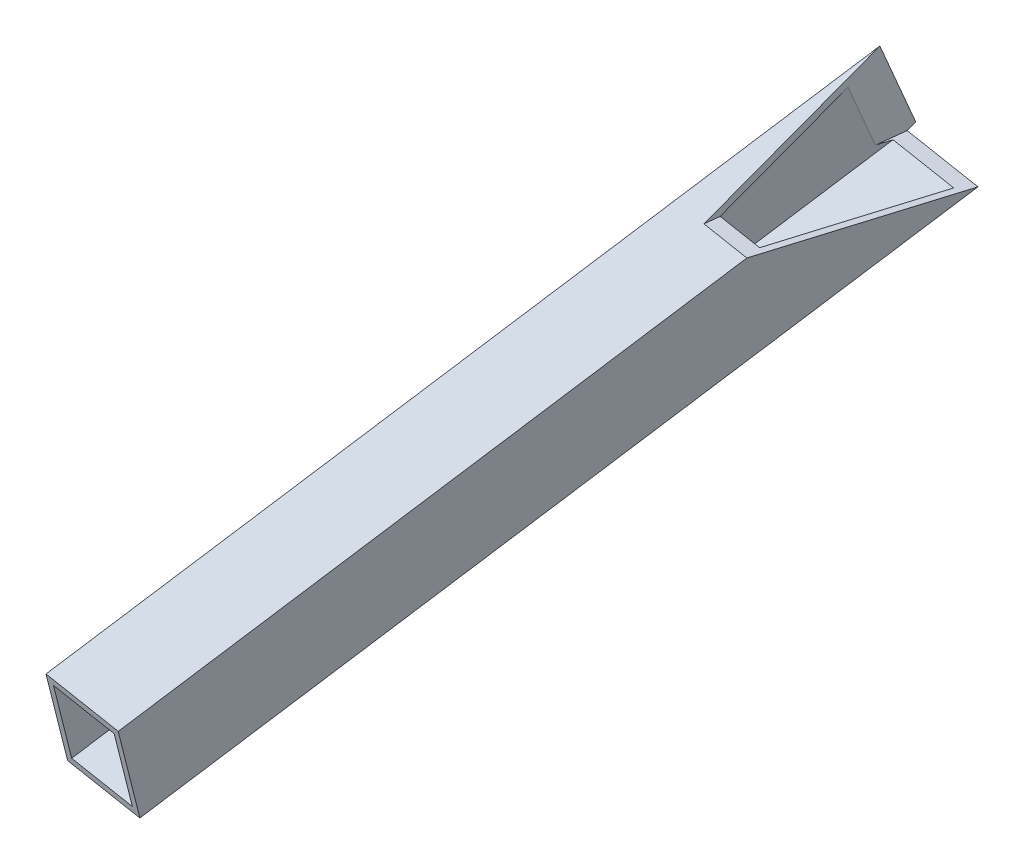
ISO-10303-21;
HEADER;
FILE_DESCRIPTION(('STEP AP214'),'2;1');
FILE_NAME('part.step','',(''),(''),'','','');
FILE_SCHEMA(('AUTOMOTIVE_DESIGN { 1 0 10303 214 1 1 1 1 }'));
ENDSEC;
DATA;
#1=APPLICATION_CONTEXT('core data for automotive mechanical design processes');
#2=APPLICATION_PROTOCOL_DEFINITION('international standard','automotive_design',2000,#1);
#3=PRODUCT_CONTEXT('',#1,'mechanical');
#4=PRODUCT('Part','Part','',(#3));
#5=PRODUCT_RELATED_PRODUCT_CATEGORY('part','',(#4));
#6=PRODUCT_DEFINITION_FORMATION('','',#4);
#7=PRODUCT_DEFINITION_CONTEXT('part definition',#1,'design');
#8=PRODUCT_DEFINITION('design','',#6,#7);
#9=PRODUCT_DEFINITION_SHAPE('','',#8);
#10=(LENGTH_UNIT() NAMED_UNIT(*) SI_UNIT(.MILLI.,.METRE.));
#11=(NAMED_UNIT(*) PLANE_ANGLE_UNIT() SI_UNIT($,.RADIAN.));
#12=(NAMED_UNIT(*) SI_UNIT($,.STERADIAN.) SOLID_ANGLE_UNIT());
#13=UNCERTAINTY_MEASURE_WITH_UNIT(LENGTH_MEASURE(1.E-05),#10,'distance_accuracy_value','');
#14=(GEOMETRIC_REPRESENTATION_CONTEXT(3) GLOBAL_UNCERTAINTY_ASSIGNED_CONTEXT((#13)) GLOBAL_UNIT_ASSIGNED_CONTEXT((#10,
#11,#12)) REPRESENTATION_CONTEXT('',''));
#15=CARTESIAN_POINT('',(0.,0.,0.));
#16=DIRECTION('',(0.,0.,1.));
#17=DIRECTION('',(1.,0.,0.));
#18=AXIS2_PLACEMENT_3D('',#15,#16,#17);
#19=CARTESIAN_POINT('',(120.271431735148,-89.5681767849917,-771.716881801796));
#20=DIRECTION('',(-0.0730777748475653,0.8837399036516,0.462237408175917));
#21=DIRECTION('',(0.,-0.463476631168993,0.886109142465104));
#22=AXIS2_PLACEMENT_3D('',#19,#20,#21);
#23=PLANE('',#22);
#24=DIRECTION('',(0.100365969727087,0.467640360068513,-0.878202235112012));
#25=VECTOR('',#24,1.);
#26=CARTESIAN_POINT('',(133.655988921439,-89.3282877179119,-770.059477831639));
#27=LINE('',#26,#25);
#28=CARTESIAN_POINT('',(150.681594928652,-10.,-919.03353039475));
#29=VERTEX_POINT('',#28);
#30=CARTESIAN_POINT('',(150.886848921255,-9.0436494434575,-920.829502830028));
#31=VERTEX_POINT('',#30);
#32=EDGE_CURVE('E123',#29,#31,#27,.T.);
#33=ORIENTED_EDGE('',*,*,#32,.F.);
#34=DIRECTION('',(-0.987732357643365,0.,-0.156156298829986));
#35=VECTOR('',#34,1.);
#36=CARTESIAN_POINT('',(143.73518973951,-10.,-920.131727609933));
#37=LINE('',#36,#35);
#38=CARTESIAN_POINT('',(170.285714285714,-10.,-915.934202224593));
#39=VERTEX_POINT('',#38);
#40=EDGE_CURVE('E113',#39,#29,#37,.T.);
#41=ORIENTED_EDGE('',*,*,#40,.F.);
#42=DIRECTION('',(0.290549227996289,0.462237408175917,-0.837805302318845));
#43=VECTOR('',#42,1.);
#44=CARTESIAN_POINT('',(120.271431735148,-89.5681767849917,-771.716881801796));
#45=LINE('',#44,#43);
#46=CARTESIAN_POINT('',(120.,-89.9999999999999,-770.934202224594));
#47=VERTEX_POINT('',#46);
#48=EDGE_CURVE('E168',#47,#39,#45,.T.);
#49=ORIENTED_EDGE('',*,*,#48,.F.);
#50=DIRECTION('',(0.987732357643365,0.,0.156156298829986));
#51=VECTOR('',#50,1.);
#52=CARTESIAN_POINT('',(120.144091938925,-89.9999999999999,-770.911421899843));
#53=LINE('',#52,#51);
#54=CARTESIAN_POINT('',(100.,-89.9999999999999,-774.096117446295));
#55=VERTEX_POINT('',#54);
#56=EDGE_CURVE('E161',#55,#47,#53,.T.);
#57=ORIENTED_EDGE('',*,*,#56,.F.);
#58=DIRECTION('',(0.290549227996289,0.462237408175917,-0.837805302318845));
#59=VECTOR('',#58,1.);
#60=CARTESIAN_POINT('',(101.190123761803,-88.1066212880405,-777.527866361722));
#61=LINE('',#60,#59);
#62=EDGE_CURVE('E131',#55,#31,#61,.T.);
#63=ORIENTED_EDGE('',*,*,#62,.T.);
#64=EDGE_LOOP('',(#33,#41,#49,#57,#63));
#65=FACE_BOUND('',#64,.T.);
#66=ADVANCED_FACE('F41',(#65),#23,.F.);
#67=CARTESIAN_POINT('',(120.271431735148,-89.5681767849917,-771.716881801796));
#68=DIRECTION('',(-0.954065398667245,0.0730777748475653,-0.290549227996289));
#69=DIRECTION('',(-0.291328168163365,0.,0.956623174732129));
#70=AXIS2_PLACEMENT_3D('',#67,#68,#69);
#71=PLANE('',#70);
#72=DIRECTION('',(0.291328168163365,0.,-0.956623174732129));
#73=VECTOR('',#72,1.);
#74=CARTESIAN_POINT('',(125.848787806292,-10.,-770.018364590088));
#75=LINE('',#74,#73);
#76=CARTESIAN_POINT('',(157.714285714286,-10.,-874.653882553704));
#77=VERTEX_POINT('',#76);
#78=EDGE_CURVE('E55',#77,#39,#75,.T.);
#79=ORIENTED_EDGE('',*,*,#78,.F.);
#80=DIRECTION('',(0.290549227996289,0.462237408175917,-0.837805302318845));
#81=VECTOR('',#80,1.);
#82=CARTESIAN_POINT('',(118.809876238197,-71.8933787119597,-762.472133638278));
#83=LINE('',#82,#81);
#84=CARTESIAN_POINT('',(120.,-69.9999999999999,-765.903882553705));
#85=VERTEX_POINT('',#84);
#86=EDGE_CURVE('E182',#85,#77,#83,.T.);
#87=ORIENTED_EDGE('',*,*,#86,.F.);
#88=DIRECTION('',(0.,0.969795585317005,0.243919090478066));
#89=VECTOR('',#88,1.);
#90=CARTESIAN_POINT('',(120.,-89.779012915687,-770.878620440732));
#91=LINE('',#90,#89);
#92=EDGE_CURVE('E158',#47,#85,#91,.T.);
#93=ORIENTED_EDGE('',*,*,#92,.F.);
#94=ORIENTED_EDGE('',*,*,#48,.T.);
#95=EDGE_LOOP('',(#79,#87,#93,#94));
#96=FACE_BOUND('',#95,.T.);
#97=ADVANCED_FACE('F209',(#96),#71,.F.);
#98=CARTESIAN_POINT('',(118.809876238197,-71.8933787119597,-762.472133638278));
#99=DIRECTION('',(0.0730777748475653,-0.8837399036516,-0.462237408175917));
#100=DIRECTION('',(0.,0.463476631168993,-0.886109142465104));
#101=AXIS2_PLACEMENT_3D('',#98,#99,#100);
#102=PLANE('',#101);
#103=DIRECTION('',(-0.100365969727087,-0.467640360068513,0.878202235112012));
#104=VECTOR('',#103,1.);
#105=CARTESIAN_POINT('',(132.593794535334,-71.646331965849,-760.765276953217));
#106=LINE('',#105,#104);
#107=CARTESIAN_POINT('',(150.029380386556,9.59219606952176,-913.326653151413));
#108=VERTEX_POINT('',#107);
#109=CARTESIAN_POINT('',(145.824461552535,-10.,-876.533613353724));
#110=VERTEX_POINT('',#109);
#111=EDGE_CURVE('E135',#108,#110,#106,.T.);
#112=ORIENTED_EDGE('',*,*,#111,.F.);
#113=DIRECTION('',(0.290549227996289,0.462237408175917,-0.837805302318845));
#114=VECTOR('',#113,1.);
#115=CARTESIAN_POINT('',(99.728568264852,-70.4318232150084,-768.283118198203));
#116=LINE('',#115,#114);
#117=CARTESIAN_POINT('',(100.,-69.9999999999999,-769.065797775406));
#118=VERTEX_POINT('',#117);
#119=EDGE_CURVE('E179',#118,#108,#116,.T.);
#120=ORIENTED_EDGE('',*,*,#119,.F.);
#121=DIRECTION('',(-0.987732357643365,0.,-0.156156298829986));
#122=VECTOR('',#121,1.);
#123=CARTESIAN_POINT('',(119.368212267789,-69.9999999999999,-766.003765516073));
#124=LINE('',#123,#122);
#125=EDGE_CURVE('E155',#85,#118,#124,.T.);
#126=ORIENTED_EDGE('',*,*,#125,.F.);
#127=ORIENTED_EDGE('',*,*,#86,.T.);
#128=DIRECTION('',(0.987732357643365,0.,0.156156298829986));
#129=VECTOR('',#128,1.);
#130=CARTESIAN_POINT('',(137.061535618228,-10.,-877.91899479864));
#131=LINE('',#130,#129);
#132=EDGE_CURVE('E138',#110,#77,#131,.T.);
#133=ORIENTED_EDGE('',*,*,#132,.F.);
#134=EDGE_LOOP('',(#112,#120,#126,#127,#133));
#135=FACE_BOUND('',#134,.T.);
#136=ADVANCED_FACE('F210',(#135),#102,.F.);
#137=CARTESIAN_POINT('',(101.190123761803,-88.1066212880405,-777.527866361722));
#138=DIRECTION('',(0.954065398667245,-0.0730777748475653,0.290549227996289));
#139=DIRECTION('',(0.291328168163365,0.,-0.956623174732129));
#140=AXIS2_PLACEMENT_3D('',#137,#138,#139);
#141=PLANE('',#140);
#142=DIRECTION('',(-0.0426436241126815,0.926797846123536,0.373131710985962));
#143=VECTOR('',#142,1.);
#144=CARTESIAN_POINT('',(151.641033769275,-25.4347725543154,-927.428620250204));
#145=LINE('',#144,#143);
#146=EDGE_CURVE('E132',#31,#108,#145,.T.);
#147=ORIENTED_EDGE('',*,*,#146,.F.);
#148=ORIENTED_EDGE('',*,*,#62,.F.);
#149=DIRECTION('',(0.,-0.969795585317005,-0.243919090478066));
#150=VECTOR('',#149,1.);
#151=CARTESIAN_POINT('',(100.,-89.0310566303201,-773.852412701671));
#152=LINE('',#151,#150);
#153=EDGE_CURVE('E152',#118,#55,#152,.T.);
#154=ORIENTED_EDGE('',*,*,#153,.F.);
#155=ORIENTED_EDGE('',*,*,#119,.T.);
#156=EDGE_LOOP('',(#147,#148,#154,#155));
#157=FACE_BOUND('',#156,.T.);
#158=ADVANCED_FACE('F215',(#157),#141,.F.);
#159=CARTESIAN_POINT('',(110.,-80.,-770.));
#160=DIRECTION('',(-0.151549664025947,-0.241101738223099,0.958594101358558));
#161=DIRECTION('',(0.,-0.969795585317005,-0.243919090478066));
#162=AXIS2_PLACEMENT_3D('',#159,#160,#161);
#163=PLANE('',#162);
#164=DIRECTION('',(0.,-0.969795585317005,-0.243919090478066));
#165=VECTOR('',#164,1.);
#166=CARTESIAN_POINT('',(101.6,-87.586087569469,-773.236026669404));
#167=LINE('',#166,#165);
#168=CARTESIAN_POINT('',(101.6,-71.6,-769.215270131341));
#169=VERTEX_POINT('',#168);
#170=CARTESIAN_POINT('',(101.6,-88.4000000000001,-773.440738654888));
#171=VERTEX_POINT('',#170);
#172=EDGE_CURVE('E149',#169,#171,#167,.T.);
#173=ORIENTED_EDGE('',*,*,#172,.F.);
#174=DIRECTION('',(-0.987732357643365,0.,-0.156156298829986));
#175=VECTOR('',#174,1.);
#176=CARTESIAN_POINT('',(117.869298304943,-71.5999999999999,-766.643163033501));
#177=LINE('',#176,#175);
#178=CARTESIAN_POINT('',(118.4,-71.6,-766.559261345112));
#179=VERTEX_POINT('',#178);
#180=EDGE_CURVE('E146',#179,#169,#177,.T.);
#181=ORIENTED_EDGE('',*,*,#180,.F.);
#182=DIRECTION('',(0.,0.969795585317005,0.243919090478066));
#183=VECTOR('',#182,1.);
#184=CARTESIAN_POINT('',(118.4,-88.2143708491772,-770.738041170215));
#185=LINE('',#184,#183);
#186=CARTESIAN_POINT('',(118.4,-88.4000000000001,-770.784729868659));
#187=VERTEX_POINT('',#186);
#188=EDGE_CURVE('E143',#187,#179,#185,.T.);
#189=ORIENTED_EDGE('',*,*,#188,.F.);
#190=DIRECTION('',(0.987732357643365,0.,0.156156298829986));
#191=VECTOR('',#190,1.);
#192=CARTESIAN_POINT('',(118.521037228697,-88.4,-770.765594395868));
#193=LINE('',#192,#191);
#194=EDGE_CURVE('E177',#171,#187,#193,.T.);
#195=ORIENTED_EDGE('',*,*,#194,.F.);
#196=EDGE_LOOP('',(#173,#181,#189,#195));
#197=FACE_BOUND('',#196,.T.);
#198=ORIENTED_EDGE('',*,*,#153,.T.);
#199=ORIENTED_EDGE('',*,*,#56,.T.);
#200=ORIENTED_EDGE('',*,*,#92,.T.);
#201=ORIENTED_EDGE('',*,*,#125,.T.);
#202=EDGE_LOOP('',(#198,#199,#200,#201));
#203=FACE_BOUND('',#202,.T.);
#204=ADVANCED_FACE('F213',(#197,#203),#163,.T.);
#205=CARTESIAN_POINT('',(102.599703959915,-86.8095618819541,-776.323407743846));
#206=DIRECTION('',(0.954065398667245,-0.0730777748475653,0.290549227996289));
#207=DIRECTION('',(0.291328168163365,0.,-0.956623174732129));
#208=AXIS2_PLACEMENT_3D('',#205,#206,#207);
#209=PLANE('',#208);
#210=DIRECTION('',(-0.291328168163365,0.,0.956623174732129));
#211=VECTOR('',#210,1.);
#212=CARTESIAN_POINT('',(107.983694062413,-10.,-774.683777829581));
#213=LINE('',#212,#211);
#214=CARTESIAN_POINT('',(150.88,-10.,-915.540738654887));
#215=VERTEX_POINT('',#214);
#216=CARTESIAN_POINT('',(149.923448115505,-10.,-912.399745779705));
#217=VERTEX_POINT('',#216);
#218=EDGE_CURVE('E48',#215,#217,#213,.T.);
#219=ORIENTED_EDGE('',*,*,#218,.T.);
#220=DIRECTION('',(-0.0426436241126815,0.926797846123536,0.373131710985962));
#221=VECTOR('',#220,1.);
#222=CARTESIAN_POINT('',(150.707855565027,-27.0479678927053,-919.263310963027));
#223=LINE('',#222,#221);
#224=CARTESIAN_POINT('',(149.268418773621,4.23612077621573,-906.668239038232));
#225=VERTEX_POINT('',#224);
#226=EDGE_CURVE('E11',#217,#225,#223,.T.);
#227=ORIENTED_EDGE('',*,*,#226,.T.);
#228=DIRECTION('',(0.290549227996289,0.462237408175917,-0.837805302318845));
#229=VECTOR('',#228,1.);
#230=CARTESIAN_POINT('',(101.371997342476,-71.9627315006072,-768.557819286491));
#231=LINE('',#230,#229);
#232=EDGE_CURVE('E174',#169,#225,#231,.T.);
#233=ORIENTED_EDGE('',*,*,#232,.F.);
#234=ORIENTED_EDGE('',*,*,#172,.T.);
#235=DIRECTION('',(0.290549227996289,0.462237408175917,-0.837805302318845));
#236=VECTOR('',#235,1.);
#237=CARTESIAN_POINT('',(102.599703959915,-86.8095618819541,-776.323407743846));
#238=LINE('',#237,#236);
#239=EDGE_CURVE('E164',#171,#215,#238,.T.);
#240=ORIENTED_EDGE('',*,*,#239,.T.);
#241=EDGE_LOOP('',(#219,#227,#233,#234,#240));
#242=FACE_BOUND('',#241,.T.);
#243=ADVANCED_FACE('F188',(#242),#209,.T.);
#244=CARTESIAN_POINT('',(117.400296040085,-73.1904381180463,-763.676592256153));
#245=DIRECTION('',(0.0730777748475653,-0.8837399036516,-0.462237408175917));
#246=DIRECTION('',(0.,0.463476631168993,-0.886109142465104));
#247=AXIS2_PLACEMENT_3D('',#244,#245,#246);
#248=PLANE('',#247);
#249=ORIENTED_EDGE('',*,*,#232,.T.);
#250=DIRECTION('',(-0.100365969727087,-0.467640360068513,0.878202235112012));
#251=VECTOR('',#250,1.);
#252=CARTESIAN_POINT('',(132.709856140856,-72.9160475619105,-761.780816001533));
#253=LINE('',#252,#251);
#254=CARTESIAN_POINT('',(146.213032222624,-10.,-879.933606717006));
#255=VERTEX_POINT('',#254);
#256=EDGE_CURVE('E133',#225,#255,#253,.T.);
#257=ORIENTED_EDGE('',*,*,#256,.T.);
#258=DIRECTION('',(0.987732357643365,0.,0.156156298829986));
#259=VECTOR('',#258,1.);
#260=CARTESIAN_POINT('',(136.034443611393,-10.,-881.542798430271));
#261=LINE('',#260,#259);
#262=CARTESIAN_POINT('',(157.12,-10.,-878.209261345111));
#263=VERTEX_POINT('',#262);
#264=EDGE_CURVE('E119',#255,#263,#261,.T.);
#265=ORIENTED_EDGE('',*,*,#264,.T.);
#266=DIRECTION('',(0.290549227996289,0.462237408175917,-0.837805302318845));
#267=VECTOR('',#266,1.);
#268=CARTESIAN_POINT('',(117.400296040085,-73.1904381180463,-763.676592256153));
#269=LINE('',#268,#267);
#270=EDGE_CURVE('E171',#179,#263,#269,.T.);
#271=ORIENTED_EDGE('',*,*,#270,.F.);
#272=ORIENTED_EDGE('',*,*,#180,.T.);
#273=EDGE_LOOP('',(#249,#257,#265,#271,#272));
#274=FACE_BOUND('',#273,.T.);
#275=ADVANCED_FACE('F217',(#274),#248,.T.);
#276=CARTESIAN_POINT('',(118.628002657525,-88.0372684993932,-771.442180713509));
#277=DIRECTION('',(-0.954065398667245,0.0730777748475653,-0.290549227996289));
#278=DIRECTION('',(-0.291328168163365,0.,0.956623174732129));
#279=AXIS2_PLACEMENT_3D('',#276,#277,#278);
#280=PLANE('',#279);
#281=ORIENTED_EDGE('',*,*,#270,.T.);
#282=DIRECTION('',(0.291328168163365,0.,-0.956623174732129));
#283=VECTOR('',#282,1.);
#284=CARTESIAN_POINT('',(124.098049236783,-10.,-769.776343326546));
#285=LINE('',#284,#283);
#286=CARTESIAN_POINT('',(167.68,-10.,-912.884729868658));
#287=VERTEX_POINT('',#286);
#288=EDGE_CURVE('E196',#263,#287,#285,.T.);
#289=ORIENTED_EDGE('',*,*,#288,.T.);
#290=DIRECTION('',(0.290549227996289,0.462237408175917,-0.837805302318845));
#291=VECTOR('',#290,1.);
#292=CARTESIAN_POINT('',(118.628002657525,-88.0372684993932,-771.442180713509));
#293=LINE('',#292,#291);
#294=EDGE_CURVE('E167',#187,#287,#293,.T.);
#295=ORIENTED_EDGE('',*,*,#294,.F.);
#296=ORIENTED_EDGE('',*,*,#188,.T.);
#297=EDGE_LOOP('',(#281,#289,#295,#296));
#298=FACE_BOUND('',#297,.T.);
#299=ADVANCED_FACE('F221',(#298),#280,.T.);
#300=CARTESIAN_POINT('',(118.628002657525,-88.0372684993932,-771.442180713509));
#301=DIRECTION('',(-0.0730777748475669,0.8837399036516,0.462237408175916));
#302=DIRECTION('',(0.,-0.463476631168992,0.886109142465104));
#303=AXIS2_PLACEMENT_3D('',#300,#301,#302);
#304=PLANE('',#303);
#305=ORIENTED_EDGE('',*,*,#294,.T.);
#306=DIRECTION('',(-0.987732357643364,0.,-0.156156298829989));
#307=VECTOR('',#306,1.);
#308=CARTESIAN_POINT('',(141.640313073271,-10.,-917.001493991757));
#309=LINE('',#308,#307);
#310=EDGE_CURVE('E126',#287,#215,#309,.T.);
#311=ORIENTED_EDGE('',*,*,#310,.T.);
#312=ORIENTED_EDGE('',*,*,#239,.F.);
#313=ORIENTED_EDGE('',*,*,#194,.T.);
#314=EDGE_LOOP('',(#305,#311,#312,#313));
#315=FACE_BOUND('',#314,.T.);
#316=ADVANCED_FACE('F194',(#315),#304,.T.);
#317=CARTESIAN_POINT('',(259.935326726564,-10.,-1698.86453408839));
#318=DIRECTION('',(0.,1.,0.));
#319=DIRECTION('',(0.,0.,1.));
#320=AXIS2_PLACEMENT_3D('',#317,#318,#319);
#321=PLANE('',#320);
#322=ORIENTED_EDGE('',*,*,#132,.T.);
#323=ORIENTED_EDGE('',*,*,#78,.T.);
#324=ORIENTED_EDGE('',*,*,#40,.T.);
#325=DIRECTION('',(-0.113546591160732,0.,0.993532672656404));
#326=VECTOR('',#325,1.);
#327=CARTESIAN_POINT('',(240.064673273436,-10.,-1701.13546591161));
#328=LINE('',#327,#326);
#329=EDGE_CURVE('E61',#29,#217,#328,.T.);
#330=ORIENTED_EDGE('',*,*,#329,.T.);
#331=ORIENTED_EDGE('',*,*,#218,.F.);
#332=ORIENTED_EDGE('',*,*,#310,.F.);
#333=ORIENTED_EDGE('',*,*,#288,.F.);
#334=ORIENTED_EDGE('',*,*,#264,.F.);
#335=EDGE_CURVE('E127',#255,#110,#328,.T.);
#336=ORIENTED_EDGE('',*,*,#335,.T.);
#337=EDGE_LOOP('',(#322,#323,#324,#330,#331,#332,#333,#334,#336));
#338=FACE_BOUND('',#337,.T.);
#339=ADVANCED_FACE('F114',(#338),#321,.T.);
#340=CARTESIAN_POINT('',(240.064673273436,10.,-1701.13546591161));
#341=DIRECTION('',(0.993532672656404,0.,0.113546591160732));
#342=DIRECTION('',(0.113546591160732,0.,-0.993532672656404));
#343=AXIS2_PLACEMENT_3D('',#340,#341,#342);
#344=PLANE('',#343);
#345=ORIENTED_EDGE('',*,*,#111,.T.);
#346=ORIENTED_EDGE('',*,*,#335,.F.);
#347=ORIENTED_EDGE('',*,*,#256,.F.);
#348=ORIENTED_EDGE('',*,*,#226,.F.);
#349=ORIENTED_EDGE('',*,*,#329,.F.);
#350=ORIENTED_EDGE('',*,*,#32,.T.);
#351=ORIENTED_EDGE('',*,*,#146,.T.);
#352=EDGE_LOOP('',(#345,#346,#347,#348,#349,#350,#351));
#353=FACE_BOUND('',#352,.T.);
#354=ADVANCED_FACE('F122',(#353),#344,.T.);
#355=CLOSED_SHELL('',(#66,#97,#136,#158,#204,#243,#275,#299,#316,#339,#354));
#356=MANIFOLD_SOLID_BREP('B2',#355);
#357=ADVANCED_BREP_SHAPE_REPRESENTATION('',(#18,#356),#14);
#358=SHAPE_DEFINITION_REPRESENTATION(#9,#357);
ENDSEC;
END-ISO-10303-21;
